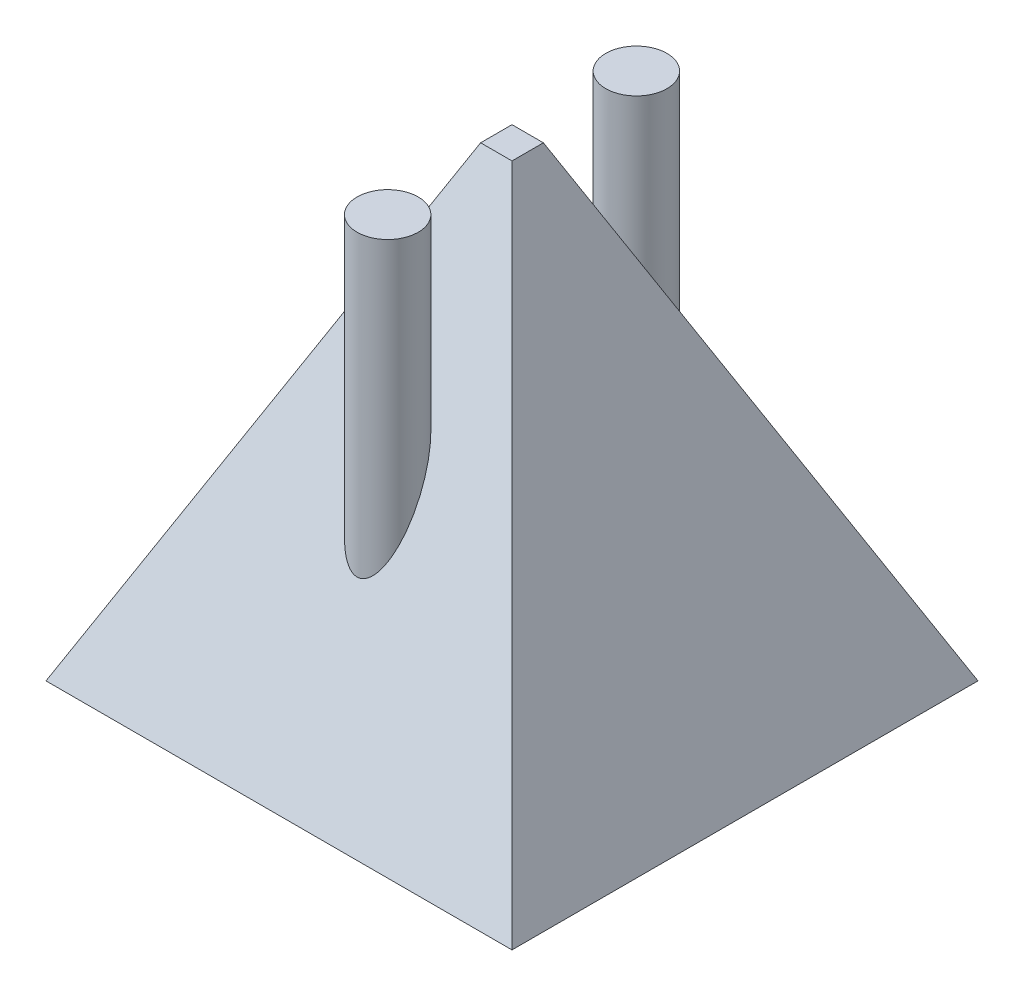
ISO-10303-21;
HEADER;
FILE_DESCRIPTION(('STEP AP214'),'2;1');
FILE_NAME('part.step','',(''),(''),'','','');
FILE_SCHEMA(('AUTOMOTIVE_DESIGN { 1 0 10303 214 1 1 1 1 }'));
ENDSEC;
DATA;
#1=APPLICATION_CONTEXT('core data for automotive mechanical design processes');
#2=APPLICATION_PROTOCOL_DEFINITION('international standard','automotive_design',2000,#1);
#3=PRODUCT_CONTEXT('',#1,'mechanical');
#4=PRODUCT('Part','Part','',(#3));
#5=PRODUCT_RELATED_PRODUCT_CATEGORY('part','',(#4));
#6=PRODUCT_DEFINITION_FORMATION('','',#4);
#7=PRODUCT_DEFINITION_CONTEXT('part definition',#1,'design');
#8=PRODUCT_DEFINITION('design','',#6,#7);
#9=PRODUCT_DEFINITION_SHAPE('','',#8);
#10=(LENGTH_UNIT() NAMED_UNIT(*) SI_UNIT(.MILLI.,.METRE.));
#11=(NAMED_UNIT(*) PLANE_ANGLE_UNIT() SI_UNIT($,.RADIAN.));
#12=(NAMED_UNIT(*) SI_UNIT($,.STERADIAN.) SOLID_ANGLE_UNIT());
#13=UNCERTAINTY_MEASURE_WITH_UNIT(LENGTH_MEASURE(1.E-05),#10,'distance_accuracy_value','');
#14=(GEOMETRIC_REPRESENTATION_CONTEXT(3) GLOBAL_UNCERTAINTY_ASSIGNED_CONTEXT((#13)) GLOBAL_UNIT_ASSIGNED_CONTEXT((#10,
#11,#12)) REPRESENTATION_CONTEXT('',''));
#15=CARTESIAN_POINT('',(0.,0.,0.));
#16=DIRECTION('',(0.,0.,1.));
#17=DIRECTION('',(1.,0.,0.));
#18=AXIS2_PLACEMENT_3D('',#15,#16,#17);
#19=CARTESIAN_POINT('',(19.05,-19.05,-19.05));
#20=DIRECTION('',(0.90630778703665,0.4226182617407,0.));
#21=DIRECTION('',(-0.4226182617407,0.90630778703665,0.));
#22=AXIS2_PLACEMENT_3D('',#19,#20,#21);
#23=PLANE('',#22);
#24=DIRECTION('',(0.,0.,-1.));
#25=VECTOR('',#24,1.);
#26=CARTESIAN_POINT('',(19.05,-19.05,-19.05));
#27=LINE('',#26,#25);
#28=CARTESIAN_POINT('',(19.05,-19.05,19.05));
#29=VERTEX_POINT('',#28);
#30=CARTESIAN_POINT('',(19.05,-19.05,-19.05));
#31=VERTEX_POINT('',#30);
#32=EDGE_CURVE('E84',#29,#31,#27,.T.);
#33=ORIENTED_EDGE('',*,*,#32,.T.);
#34=DIRECTION('',(0.389281620635026,-0.834817129478987,-0.389281620635026));
#35=VECTOR('',#34,1.);
#36=CARTESIAN_POINT('',(13.2763191357428,-6.66830142978677,-13.2763191357428));
#37=LINE('',#36,#35);
#38=CARTESIAN_POINT('',(1.28367822429451,19.05,-1.28367822429451));
#39=VERTEX_POINT('',#38);
#40=EDGE_CURVE('E89',#39,#31,#37,.T.);
#41=ORIENTED_EDGE('',*,*,#40,.F.);
#42=DIRECTION('',(0.,0.,1.));
#43=VECTOR('',#42,1.);
#44=CARTESIAN_POINT('',(1.28367822429451,19.05,-19.05));
#45=LINE('',#44,#43);
#46=CARTESIAN_POINT('',(1.28367822429451,19.05,1.28367822429451));
#47=VERTEX_POINT('',#46);
#48=EDGE_CURVE('E104',#47,#39,#45,.F.);
#49=ORIENTED_EDGE('',*,*,#48,.F.);
#50=DIRECTION('',(0.389281620635026,-0.834817129478987,0.389281620635026));
#51=VECTOR('',#50,1.);
#52=CARTESIAN_POINT('',(13.2763191357428,-6.66830142978677,13.2763191357428));
#53=LINE('',#52,#51);
#54=EDGE_CURVE('E94',#47,#29,#53,.T.);
#55=ORIENTED_EDGE('',*,*,#54,.T.);
#56=EDGE_LOOP('',(#33,#41,#49,#55));
#57=FACE_BOUND('',#56,.T.);
#58=ADVANCED_FACE('F33',(#57),#23,.T.);
#59=CARTESIAN_POINT('',(-19.05,-19.05,-19.05));
#60=DIRECTION('',(0.,0.4226182617407,-0.90630778703665));
#61=DIRECTION('',(0.,0.90630778703665,0.4226182617407));
#62=AXIS2_PLACEMENT_3D('',#59,#60,#61);
#63=PLANE('',#62);
#64=CARTESIAN_POINT('',(0.,0.,-10.1668391121473));
#65=DIRECTION('',(0.,0.4226182617407,-0.90630778703665));
#66=DIRECTION('',(0.,-0.90630778703665,-0.4226182617407));
#67=AXIS2_PLACEMENT_3D('',#64,#65,#66);
#68=ELLIPSE('',#67,5.91550395788124,2.5);
#69=CARTESIAN_POINT('',(0.,-5.36126730127389,-12.6668391121473));
#70=VERTEX_POINT('',#69);
#71=EDGE_CURVE('E43',#70,#70,#68,.T.);
#72=ORIENTED_EDGE('',*,*,#71,.F.);
#73=EDGE_LOOP('',(#72));
#74=FACE_BOUND('',#73,.T.);
#75=DIRECTION('',(-1.,0.,0.));
#76=VECTOR('',#75,1.);
#77=CARTESIAN_POINT('',(-19.05,-19.05,-19.05));
#78=LINE('',#77,#76);
#79=CARTESIAN_POINT('',(-19.05,-19.05,-19.05));
#80=VERTEX_POINT('',#79);
#81=EDGE_CURVE('E81',#31,#80,#78,.T.);
#82=ORIENTED_EDGE('',*,*,#81,.T.);
#83=DIRECTION('',(-0.389281620635026,-0.834817129478987,-0.389281620635026));
#84=VECTOR('',#83,1.);
#85=CARTESIAN_POINT('',(-19.05,-19.05,-19.05));
#86=LINE('',#85,#84);
#87=CARTESIAN_POINT('',(-1.28367822429451,19.05,-1.28367822429451));
#88=VERTEX_POINT('',#87);
#89=EDGE_CURVE('E92',#88,#80,#86,.T.);
#90=ORIENTED_EDGE('',*,*,#89,.F.);
#91=DIRECTION('',(1.,0.,0.));
#92=VECTOR('',#91,1.);
#93=CARTESIAN_POINT('',(-19.05,19.05,-1.28367822429451));
#94=LINE('',#93,#92);
#95=EDGE_CURVE('E37',#39,#88,#94,.F.);
#96=ORIENTED_EDGE('',*,*,#95,.F.);
#97=ORIENTED_EDGE('',*,*,#40,.T.);
#98=EDGE_LOOP('',(#82,#90,#96,#97));
#99=FACE_BOUND('',#98,.T.);
#100=ADVANCED_FACE('F35',(#74,#99),#63,.T.);
#101=CARTESIAN_POINT('',(-19.05,-19.05,-19.05));
#102=DIRECTION('',(-0.90630778703665,0.4226182617407,0.));
#103=DIRECTION('',(-0.4226182617407,-0.90630778703665,0.));
#104=AXIS2_PLACEMENT_3D('',#101,#102,#103);
#105=PLANE('',#104);
#106=DIRECTION('',(0.,0.,1.));
#107=VECTOR('',#106,1.);
#108=CARTESIAN_POINT('',(-19.05,-19.05,-19.05));
#109=LINE('',#108,#107);
#110=CARTESIAN_POINT('',(-19.05,-19.05,19.05));
#111=VERTEX_POINT('',#110);
#112=EDGE_CURVE('E85',#80,#111,#109,.T.);
#113=ORIENTED_EDGE('',*,*,#112,.T.);
#114=DIRECTION('',(-0.389281620635026,-0.834817129478987,0.389281620635026));
#115=VECTOR('',#114,1.);
#116=CARTESIAN_POINT('',(-19.05,-19.05,19.05));
#117=LINE('',#116,#115);
#118=CARTESIAN_POINT('',(-1.28367822429451,19.05,1.28367822429451));
#119=VERTEX_POINT('',#118);
#120=EDGE_CURVE('E105',#119,#111,#117,.T.);
#121=ORIENTED_EDGE('',*,*,#120,.F.);
#122=DIRECTION('',(0.,0.,-1.));
#123=VECTOR('',#122,1.);
#124=CARTESIAN_POINT('',(-1.28367822429451,19.05,-19.05));
#125=LINE('',#124,#123);
#126=EDGE_CURVE('E109',#88,#119,#125,.F.);
#127=ORIENTED_EDGE('',*,*,#126,.F.);
#128=ORIENTED_EDGE('',*,*,#89,.T.);
#129=EDGE_LOOP('',(#113,#121,#127,#128));
#130=FACE_BOUND('',#129,.T.);
#131=ADVANCED_FACE('F115',(#130),#105,.T.);
#132=CARTESIAN_POINT('',(-19.05,-19.05,19.05));
#133=DIRECTION('',(0.,0.4226182617407,0.90630778703665));
#134=DIRECTION('',(0.,-0.90630778703665,0.4226182617407));
#135=AXIS2_PLACEMENT_3D('',#132,#133,#134);
#136=PLANE('',#135);
#137=CARTESIAN_POINT('',(0.,0.,10.1668391121473));
#138=DIRECTION('',(0.,0.4226182617407,0.90630778703665));
#139=DIRECTION('',(0.,-0.90630778703665,0.4226182617407));
#140=AXIS2_PLACEMENT_3D('',#137,#138,#139);
#141=ELLIPSE('',#140,5.91550395788124,2.5);
#142=CARTESIAN_POINT('',(0.,-5.36126730127389,12.6668391121473));
#143=VERTEX_POINT('',#142);
#144=EDGE_CURVE('E11',#143,#143,#141,.T.);
#145=ORIENTED_EDGE('',*,*,#144,.F.);
#146=EDGE_LOOP('',(#145));
#147=FACE_BOUND('',#146,.T.);
#148=DIRECTION('',(1.,0.,0.));
#149=VECTOR('',#148,1.);
#150=CARTESIAN_POINT('',(-19.05,-19.05,19.05));
#151=LINE('',#150,#149);
#152=EDGE_CURVE('E68',#111,#29,#151,.T.);
#153=ORIENTED_EDGE('',*,*,#152,.T.);
#154=ORIENTED_EDGE('',*,*,#54,.F.);
#155=DIRECTION('',(-1.,0.,0.));
#156=VECTOR('',#155,1.);
#157=CARTESIAN_POINT('',(-19.05,19.05,1.28367822429451));
#158=LINE('',#157,#156);
#159=EDGE_CURVE('E52',#119,#47,#158,.F.);
#160=ORIENTED_EDGE('',*,*,#159,.F.);
#161=ORIENTED_EDGE('',*,*,#120,.T.);
#162=EDGE_LOOP('',(#153,#154,#160,#161));
#163=FACE_BOUND('',#162,.T.);
#164=ADVANCED_FACE('F116',(#147,#163),#136,.T.);
#165=CARTESIAN_POINT('',(0.,19.05,0.));
#166=DIRECTION('',(0.,1.,0.));
#167=DIRECTION('',(0.,0.,1.));
#168=AXIS2_PLACEMENT_3D('',#165,#166,#167);
#169=PLANE('',#168);
#170=ORIENTED_EDGE('',*,*,#48,.T.);
#171=ORIENTED_EDGE('',*,*,#95,.T.);
#172=ORIENTED_EDGE('',*,*,#126,.T.);
#173=ORIENTED_EDGE('',*,*,#159,.T.);
#174=EDGE_LOOP('',(#170,#171,#172,#173));
#175=FACE_BOUND('',#174,.T.);
#176=ADVANCED_FACE('F111',(#175),#169,.T.);
#177=CARTESIAN_POINT('',(0.,-19.05,0.));
#178=DIRECTION('',(0.,1.,0.));
#179=DIRECTION('',(0.,0.,1.));
#180=AXIS2_PLACEMENT_3D('',#177,#178,#179);
#181=PLANE('',#180);
#182=ORIENTED_EDGE('',*,*,#32,.F.);
#183=ORIENTED_EDGE('',*,*,#152,.F.);
#184=ORIENTED_EDGE('',*,*,#112,.F.);
#185=ORIENTED_EDGE('',*,*,#81,.F.);
#186=EDGE_LOOP('',(#182,#183,#184,#185));
#187=FACE_BOUND('',#186,.T.);
#188=ADVANCED_FACE('F82',(#187),#181,.F.);
#189=CARTESIAN_POINT('',(0.,19.05,-10.1668391121473));
#190=DIRECTION('',(0.,-1.,0.));
#191=DIRECTION('',(0.,0.,-1.));
#192=AXIS2_PLACEMENT_3D('',#189,#190,#191);
#193=CYLINDRICAL_SURFACE('',#192,2.5);
#194=CARTESIAN_POINT('',(0.,19.05,-10.1668391121473));
#195=DIRECTION('',(0.,1.,0.));
#196=DIRECTION('',(0.,0.,1.));
#197=AXIS2_PLACEMENT_3D('',#194,#195,#196);
#198=CIRCLE('',#197,2.5);
#199=CARTESIAN_POINT('',(0.,19.05,-7.66683911214725));
#200=VERTEX_POINT('',#199);
#201=EDGE_CURVE('E95',#200,#200,#198,.T.);
#202=ORIENTED_EDGE('',*,*,#201,.F.);
#203=EDGE_LOOP('',(#202));
#204=FACE_BOUND('',#203,.T.);
#205=ORIENTED_EDGE('',*,*,#71,.T.);
#206=EDGE_LOOP('',(#205));
#207=FACE_BOUND('',#206,.T.);
#208=ADVANCED_FACE('F137',(#204,#207),#193,.T.);
#209=CARTESIAN_POINT('',(0.,19.05,-10.1668391121473));
#210=DIRECTION('',(0.,1.,0.));
#211=DIRECTION('',(0.,0.,1.));
#212=AXIS2_PLACEMENT_3D('',#209,#210,#211);
#213=PLANE('',#212);
#214=ORIENTED_EDGE('',*,*,#201,.T.);
#215=EDGE_LOOP('',(#214));
#216=FACE_BOUND('',#215,.T.);
#217=ADVANCED_FACE('F139',(#216),#213,.T.);
#218=CARTESIAN_POINT('',(0.,19.05,10.1668391121473));
#219=DIRECTION('',(0.,-1.,0.));
#220=DIRECTION('',(0.,0.,-1.));
#221=AXIS2_PLACEMENT_3D('',#218,#219,#220);
#222=CYLINDRICAL_SURFACE('',#221,2.5);
#223=CARTESIAN_POINT('',(0.,19.05,10.1668391121473));
#224=DIRECTION('',(0.,1.,0.));
#225=DIRECTION('',(0.,0.,-1.));
#226=AXIS2_PLACEMENT_3D('',#223,#224,#225);
#227=CIRCLE('',#226,2.5);
#228=CARTESIAN_POINT('',(0.,19.05,7.66683911214725));
#229=VERTEX_POINT('',#228);
#230=EDGE_CURVE('E98',#229,#229,#227,.T.);
#231=ORIENTED_EDGE('',*,*,#230,.F.);
#232=EDGE_LOOP('',(#231));
#233=FACE_BOUND('',#232,.T.);
#234=ORIENTED_EDGE('',*,*,#144,.T.);
#235=EDGE_LOOP('',(#234));
#236=FACE_BOUND('',#235,.T.);
#237=ADVANCED_FACE('F146',(#233,#236),#222,.T.);
#238=CARTESIAN_POINT('',(0.,19.05,10.1668391121473));
#239=DIRECTION('',(0.,-1.,0.));
#240=DIRECTION('',(0.,0.,-1.));
#241=AXIS2_PLACEMENT_3D('',#238,#239,#240);
#242=PLANE('',#241);
#243=ORIENTED_EDGE('',*,*,#230,.T.);
#244=EDGE_LOOP('',(#243));
#245=FACE_BOUND('',#244,.T.);
#246=ADVANCED_FACE('F154',(#245),#242,.F.);
#247=CLOSED_SHELL('',(#58,#100,#131,#164,#176,#188,#208,#217,#237,#246));
#248=MANIFOLD_SOLID_BREP('B2',#247);
#249=ADVANCED_BREP_SHAPE_REPRESENTATION('',(#18,#248),#14);
#250=SHAPE_DEFINITION_REPRESENTATION(#9,#249);
ENDSEC;
END-ISO-10303-21;
